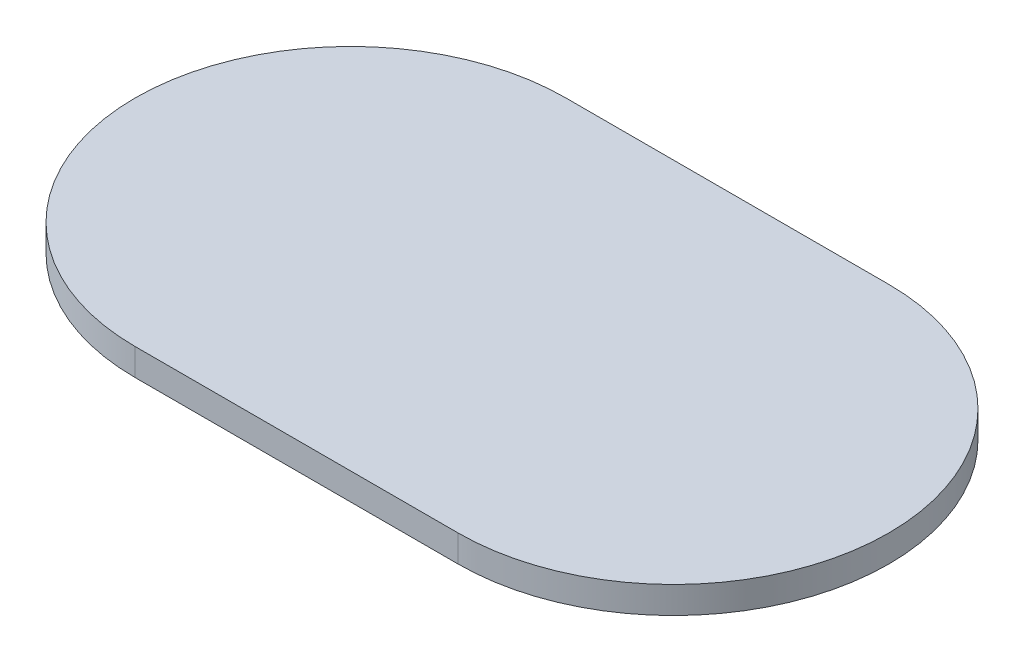
ISO-10303-21;
HEADER;
FILE_DESCRIPTION(('STEP AP214'),'2;1');
FILE_NAME('part.step','',(''),(''),'','','');
FILE_SCHEMA(('AUTOMOTIVE_DESIGN { 1 0 10303 214 1 1 1 1 }'));
ENDSEC;
DATA;
#1=APPLICATION_CONTEXT('core data for automotive mechanical design processes');
#2=APPLICATION_PROTOCOL_DEFINITION('international standard','automotive_design',2000,#1);
#3=PRODUCT_CONTEXT('',#1,'mechanical');
#4=PRODUCT('Part','Part','',(#3));
#5=PRODUCT_RELATED_PRODUCT_CATEGORY('part','',(#4));
#6=PRODUCT_DEFINITION_FORMATION('','',#4);
#7=PRODUCT_DEFINITION_CONTEXT('part definition',#1,'design');
#8=PRODUCT_DEFINITION('design','',#6,#7);
#9=PRODUCT_DEFINITION_SHAPE('','',#8);
#10=(LENGTH_UNIT() NAMED_UNIT(*) SI_UNIT(.MILLI.,.METRE.));
#11=(NAMED_UNIT(*) PLANE_ANGLE_UNIT() SI_UNIT($,.RADIAN.));
#12=(NAMED_UNIT(*) SI_UNIT($,.STERADIAN.) SOLID_ANGLE_UNIT());
#13=UNCERTAINTY_MEASURE_WITH_UNIT(LENGTH_MEASURE(1.E-05),#10,'distance_accuracy_value','');
#14=(GEOMETRIC_REPRESENTATION_CONTEXT(3) GLOBAL_UNCERTAINTY_ASSIGNED_CONTEXT((#13)) GLOBAL_UNIT_ASSIGNED_CONTEXT((#10,
#11,#12)) REPRESENTATION_CONTEXT('',''));
#15=CARTESIAN_POINT('',(0.,0.,0.));
#16=DIRECTION('',(0.,0.,1.));
#17=DIRECTION('',(1.,0.,0.));
#18=AXIS2_PLACEMENT_3D('',#15,#16,#17);
#19=CARTESIAN_POINT('',(30.,5.,-40.));
#20=DIRECTION('',(0.,-1.,0.));
#21=DIRECTION('',(0.,0.,-1.));
#22=AXIS2_PLACEMENT_3D('',#19,#20,#21);
#23=CYLINDRICAL_SURFACE('',#22,40.);
#24=CARTESIAN_POINT('',(30.,0.,-40.));
#25=DIRECTION('',(0.,1.,0.));
#26=DIRECTION('',(0.,0.,1.));
#27=AXIS2_PLACEMENT_3D('',#24,#25,#26);
#28=CIRCLE('',#27,40.);
#29=CARTESIAN_POINT('',(30.,0.,0.));
#30=VERTEX_POINT('',#29);
#31=CARTESIAN_POINT('',(30.,0.,-80.));
#32=VERTEX_POINT('',#31);
#33=EDGE_CURVE('E96',#30,#32,#28,.T.);
#34=ORIENTED_EDGE('',*,*,#33,.T.);
#35=DIRECTION('',(0.,-1.,0.));
#36=VECTOR('',#35,1.);
#37=CARTESIAN_POINT('',(30.,5.,-80.));
#38=LINE('',#37,#36);
#39=CARTESIAN_POINT('',(30.,5.,-80.));
#40=VERTEX_POINT('',#39);
#41=EDGE_CURVE('E11',#40,#32,#38,.T.);
#42=ORIENTED_EDGE('',*,*,#41,.F.);
#43=CARTESIAN_POINT('',(30.,5.,-40.));
#44=DIRECTION('',(0.,1.,0.));
#45=DIRECTION('',(0.,0.,1.));
#46=AXIS2_PLACEMENT_3D('',#43,#44,#45);
#47=CIRCLE('',#46,40.);
#48=CARTESIAN_POINT('',(30.,5.,0.));
#49=VERTEX_POINT('',#48);
#50=EDGE_CURVE('E84',#49,#40,#47,.T.);
#51=ORIENTED_EDGE('',*,*,#50,.F.);
#52=DIRECTION('',(0.,-1.,0.));
#53=VECTOR('',#52,1.);
#54=CARTESIAN_POINT('',(30.,5.,0.));
#55=LINE('',#54,#53);
#56=EDGE_CURVE('E92',#49,#30,#55,.T.);
#57=ORIENTED_EDGE('',*,*,#56,.T.);
#58=EDGE_LOOP('',(#34,#42,#51,#57));
#59=FACE_BOUND('',#58,.T.);
#60=ADVANCED_FACE('F33',(#59),#23,.T.);
#61=CARTESIAN_POINT('',(30.,5.,-80.));
#62=DIRECTION('',(0.,0.,1.));
#63=DIRECTION('',(1.,0.,0.));
#64=AXIS2_PLACEMENT_3D('',#61,#62,#63);
#65=PLANE('',#64);
#66=DIRECTION('',(-1.,0.,0.));
#67=VECTOR('',#66,1.);
#68=CARTESIAN_POINT('',(30.,0.,-80.));
#69=LINE('',#68,#67);
#70=CARTESIAN_POINT('',(-30.,0.,-80.));
#71=VERTEX_POINT('',#70);
#72=EDGE_CURVE('E88',#32,#71,#69,.T.);
#73=ORIENTED_EDGE('',*,*,#72,.T.);
#74=DIRECTION('',(0.,-1.,0.));
#75=VECTOR('',#74,1.);
#76=CARTESIAN_POINT('',(-30.,5.,-80.));
#77=LINE('',#76,#75);
#78=CARTESIAN_POINT('',(-30.,5.,-80.));
#79=VERTEX_POINT('',#78);
#80=EDGE_CURVE('E41',#79,#71,#77,.T.);
#81=ORIENTED_EDGE('',*,*,#80,.F.);
#82=DIRECTION('',(-1.,0.,0.));
#83=VECTOR('',#82,1.);
#84=CARTESIAN_POINT('',(30.,5.,-80.));
#85=LINE('',#84,#83);
#86=EDGE_CURVE('E79',#40,#79,#85,.T.);
#87=ORIENTED_EDGE('',*,*,#86,.F.);
#88=ORIENTED_EDGE('',*,*,#41,.T.);
#89=EDGE_LOOP('',(#73,#81,#87,#88));
#90=FACE_BOUND('',#89,.T.);
#91=ADVANCED_FACE('F87',(#90),#65,.F.);
#92=CARTESIAN_POINT('',(-30.,5.,-40.));
#93=DIRECTION('',(0.,-1.,0.));
#94=DIRECTION('',(0.,0.,-1.));
#95=AXIS2_PLACEMENT_3D('',#92,#93,#94);
#96=CYLINDRICAL_SURFACE('',#95,40.);
#97=CARTESIAN_POINT('',(-30.,0.,-40.));
#98=DIRECTION('',(0.,1.,0.));
#99=DIRECTION('',(0.,0.,1.));
#100=AXIS2_PLACEMENT_3D('',#97,#98,#99);
#101=CIRCLE('',#100,40.);
#102=CARTESIAN_POINT('',(-30.,0.,0.));
#103=VERTEX_POINT('',#102);
#104=EDGE_CURVE('E66',#71,#103,#101,.T.);
#105=ORIENTED_EDGE('',*,*,#104,.T.);
#106=DIRECTION('',(0.,-1.,0.));
#107=VECTOR('',#106,1.);
#108=CARTESIAN_POINT('',(-30.,5.,0.));
#109=LINE('',#108,#107);
#110=CARTESIAN_POINT('',(-30.,5.,0.));
#111=VERTEX_POINT('',#110);
#112=EDGE_CURVE('E89',#111,#103,#109,.T.);
#113=ORIENTED_EDGE('',*,*,#112,.F.);
#114=CARTESIAN_POINT('',(-30.,5.,-40.));
#115=DIRECTION('',(0.,1.,0.));
#116=DIRECTION('',(0.,0.,1.));
#117=AXIS2_PLACEMENT_3D('',#114,#115,#116);
#118=CIRCLE('',#117,40.);
#119=EDGE_CURVE('E82',#79,#111,#118,.T.);
#120=ORIENTED_EDGE('',*,*,#119,.F.);
#121=ORIENTED_EDGE('',*,*,#80,.T.);
#122=EDGE_LOOP('',(#105,#113,#120,#121));
#123=FACE_BOUND('',#122,.T.);
#124=ADVANCED_FACE('F90',(#123),#96,.T.);
#125=CARTESIAN_POINT('',(30.,5.,0.));
#126=DIRECTION('',(0.,0.,-1.));
#127=DIRECTION('',(-1.,0.,0.));
#128=AXIS2_PLACEMENT_3D('',#125,#126,#127);
#129=PLANE('',#128);
#130=DIRECTION('',(1.,0.,0.));
#131=VECTOR('',#130,1.);
#132=CARTESIAN_POINT('',(30.,0.,0.));
#133=LINE('',#132,#131);
#134=EDGE_CURVE('E72',#103,#30,#133,.T.);
#135=ORIENTED_EDGE('',*,*,#134,.T.);
#136=ORIENTED_EDGE('',*,*,#56,.F.);
#137=DIRECTION('',(1.,0.,0.));
#138=VECTOR('',#137,1.);
#139=CARTESIAN_POINT('',(30.,5.,0.));
#140=LINE('',#139,#138);
#141=EDGE_CURVE('E49',#111,#49,#140,.T.);
#142=ORIENTED_EDGE('',*,*,#141,.F.);
#143=ORIENTED_EDGE('',*,*,#112,.T.);
#144=EDGE_LOOP('',(#135,#136,#142,#143));
#145=FACE_BOUND('',#144,.T.);
#146=ADVANCED_FACE('F103',(#145),#129,.F.);
#147=CARTESIAN_POINT('',(30.,5.,-40.));
#148=DIRECTION('',(0.,1.,0.));
#149=DIRECTION('',(0.,0.,1.));
#150=AXIS2_PLACEMENT_3D('',#147,#148,#149);
#151=PLANE('',#150);
#152=ORIENTED_EDGE('',*,*,#50,.T.);
#153=ORIENTED_EDGE('',*,*,#86,.T.);
#154=ORIENTED_EDGE('',*,*,#119,.T.);
#155=ORIENTED_EDGE('',*,*,#141,.T.);
#156=EDGE_LOOP('',(#152,#153,#154,#155));
#157=FACE_BOUND('',#156,.T.);
#158=ADVANCED_FACE('F80',(#157),#151,.T.);
#159=CARTESIAN_POINT('',(30.,0.,-40.));
#160=DIRECTION('',(0.,1.,0.));
#161=DIRECTION('',(0.,0.,1.));
#162=AXIS2_PLACEMENT_3D('',#159,#160,#161);
#163=PLANE('',#162);
#164=ORIENTED_EDGE('',*,*,#33,.F.);
#165=ORIENTED_EDGE('',*,*,#134,.F.);
#166=ORIENTED_EDGE('',*,*,#104,.F.);
#167=ORIENTED_EDGE('',*,*,#72,.F.);
#168=EDGE_LOOP('',(#164,#165,#166,#167));
#169=FACE_BOUND('',#168,.T.);
#170=ADVANCED_FACE('F106',(#169),#163,.F.);
#171=CLOSED_SHELL('',(#60,#91,#124,#146,#158,#170));
#172=MANIFOLD_SOLID_BREP('B2',#171);
#173=ADVANCED_BREP_SHAPE_REPRESENTATION('',(#18,#172),#14);
#174=SHAPE_DEFINITION_REPRESENTATION(#9,#173);
ENDSEC;
END-ISO-10303-21;
